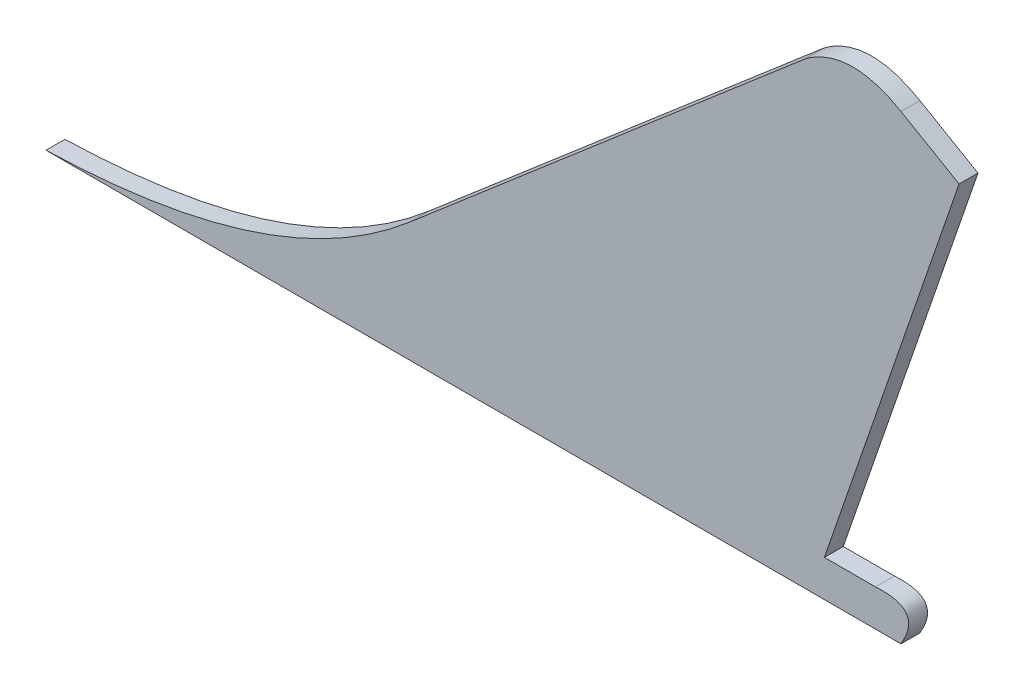
ISO-10303-21;
HEADER;
FILE_DESCRIPTION(('STEP AP214'),'2;1');
FILE_NAME('part.step','',(''),(''),'','','');
FILE_SCHEMA(('AUTOMOTIVE_DESIGN { 1 0 10303 214 1 1 1 1 }'));
ENDSEC;
DATA;
#1=APPLICATION_CONTEXT('core data for automotive mechanical design processes');
#2=APPLICATION_PROTOCOL_DEFINITION('international standard','automotive_design',2000,#1);
#3=PRODUCT_CONTEXT('',#1,'mechanical');
#4=PRODUCT('Part','Part','',(#3));
#5=PRODUCT_RELATED_PRODUCT_CATEGORY('part','',(#4));
#6=PRODUCT_DEFINITION_FORMATION('','',#4);
#7=PRODUCT_DEFINITION_CONTEXT('part definition',#1,'design');
#8=PRODUCT_DEFINITION('design','',#6,#7);
#9=PRODUCT_DEFINITION_SHAPE('','',#8);
#10=(LENGTH_UNIT() NAMED_UNIT(*) SI_UNIT(.MILLI.,.METRE.));
#11=(NAMED_UNIT(*) PLANE_ANGLE_UNIT() SI_UNIT($,.RADIAN.));
#12=(NAMED_UNIT(*) SI_UNIT($,.STERADIAN.) SOLID_ANGLE_UNIT());
#13=UNCERTAINTY_MEASURE_WITH_UNIT(LENGTH_MEASURE(1.E-05),#10,'distance_accuracy_value','');
#14=(GEOMETRIC_REPRESENTATION_CONTEXT(3) GLOBAL_UNCERTAINTY_ASSIGNED_CONTEXT((#13)) GLOBAL_UNIT_ASSIGNED_CONTEXT((#10,
#11,#12)) REPRESENTATION_CONTEXT('',''));
#15=CARTESIAN_POINT('',(0.,0.,0.));
#16=DIRECTION('',(0.,0.,1.));
#17=DIRECTION('',(1.,0.,0.));
#18=AXIS2_PLACEMENT_3D('',#15,#16,#17);
#19=CARTESIAN_POINT('',(11654.9305342296,3598.52963592277,100.));
#20=CARTESIAN_POINT('',(11109.5753336696,3130.94299727136,100.));
#21=CARTESIAN_POINT('',(10415.4410981808,2985.30812270798,100.));
#22=CARTESIAN_POINT('',(9730.00719467646,2965.05728121429,100.));
#23=B_SPLINE_CURVE_WITH_KNOTS('',3,(#19,#20,#21,#22),.UNSPECIFIED.,.F.,.F.,(4,4),(0.,1.),.UNSPECIFIED.);
#24=DIRECTION('',(0.,0.,-1.));
#25=VECTOR('',#24,1.);
#26=SURFACE_OF_LINEAR_EXTRUSION('',#23,#25);
#27=CARTESIAN_POINT('',(11654.9305342296,3598.52963592277,0.));
#28=CARTESIAN_POINT('',(11109.5753336696,3130.94299727136,0.));
#29=CARTESIAN_POINT('',(10415.4410981808,2985.30812270798,0.));
#30=CARTESIAN_POINT('',(9730.00719467646,2965.05728121429,0.));
#31=B_SPLINE_CURVE_WITH_KNOTS('',3,(#27,#28,#29,#30),.UNSPECIFIED.,.F.,.F.,(4,4),(0.,1.),.UNSPECIFIED.);
#32=CARTESIAN_POINT('',(11654.9305342296,3598.52963592277,0.));
#33=VERTEX_POINT('',#32);
#34=CARTESIAN_POINT('',(9730.00719467646,2965.05728121429,0.));
#35=VERTEX_POINT('',#34);
#36=EDGE_CURVE('E193',#33,#35,#31,.T.);
#37=ORIENTED_EDGE('',*,*,#36,.T.);
#38=DIRECTION('',(0.,0.,-1.));
#39=VECTOR('',#38,1.);
#40=CARTESIAN_POINT('',(9730.00719467646,2965.05728121429,100.));
#41=LINE('',#40,#39);
#42=CARTESIAN_POINT('',(9730.00719467646,2965.05728121429,100.));
#43=VERTEX_POINT('',#42);
#44=EDGE_CURVE('E11',#43,#35,#41,.T.);
#45=ORIENTED_EDGE('',*,*,#44,.F.);
#46=CARTESIAN_POINT('',(11654.9305342296,3598.52963592277,100.));
#47=VERTEX_POINT('',#46);
#48=EDGE_CURVE('E210',#47,#43,#23,.T.);
#49=ORIENTED_EDGE('',*,*,#48,.F.);
#50=DIRECTION('',(0.,0.,-1.));
#51=VECTOR('',#50,1.);
#52=CARTESIAN_POINT('',(11654.9305342296,3598.52963592277,100.));
#53=LINE('',#52,#51);
#54=EDGE_CURVE('E127',#47,#33,#53,.T.);
#55=ORIENTED_EDGE('',*,*,#54,.T.);
#56=EDGE_LOOP('',(#37,#45,#49,#55));
#57=FACE_BOUND('',#56,.T.);
#58=ADVANCED_FACE('F34',(#57),#26,.F.);
#59=CARTESIAN_POINT('',(9730.00719467646,2965.05728121429,100.));
#60=DIRECTION('',(0.,1.,0.));
#61=DIRECTION('',(0.,0.,1.));
#62=AXIS2_PLACEMENT_3D('',#59,#60,#61);
#63=PLANE('',#62);
#64=DIRECTION('',(1.,0.,0.));
#65=VECTOR('',#64,1.);
#66=CARTESIAN_POINT('',(9730.00719467646,2965.05728121429,0.));
#67=LINE('',#66,#65);
#68=CARTESIAN_POINT('',(14253.5770426264,2965.05728121429,0.));
#69=VERTEX_POINT('',#68);
#70=EDGE_CURVE('E190',#35,#69,#67,.T.);
#71=ORIENTED_EDGE('',*,*,#70,.T.);
#72=DIRECTION('',(0.,0.,-1.));
#73=VECTOR('',#72,1.);
#74=CARTESIAN_POINT('',(14253.5770426264,2965.05728121429,100.));
#75=LINE('',#74,#73);
#76=CARTESIAN_POINT('',(14253.5770426264,2965.05728121429,100.));
#77=VERTEX_POINT('',#76);
#78=EDGE_CURVE('E43',#77,#69,#75,.T.);
#79=ORIENTED_EDGE('',*,*,#78,.F.);
#80=DIRECTION('',(1.,0.,0.));
#81=VECTOR('',#80,1.);
#82=CARTESIAN_POINT('',(9730.00719467646,2965.05728121429,100.));
#83=LINE('',#82,#81);
#84=EDGE_CURVE('E94',#43,#77,#83,.T.);
#85=ORIENTED_EDGE('',*,*,#84,.F.);
#86=ORIENTED_EDGE('',*,*,#44,.T.);
#87=EDGE_LOOP('',(#71,#79,#85,#86));
#88=FACE_BOUND('',#87,.T.);
#89=ADVANCED_FACE('F156',(#88),#63,.F.);
#90=CARTESIAN_POINT('',(14253.5770426264,2965.05728121429,100.));
#91=CARTESIAN_POINT('',(14378.3959916559,3174.21126567757,100.));
#92=CARTESIAN_POINT('',(14118.8324088577,3158.60324778963,100.));
#93=B_SPLINE_CURVE_WITH_KNOTS('',2,(#90,#91,#92),.UNSPECIFIED.,.F.,.F.,(3,3),(0.,1.),.UNSPECIFIED.);
#94=DIRECTION('',(0.,0.,-1.));
#95=VECTOR('',#94,1.);
#96=SURFACE_OF_LINEAR_EXTRUSION('',#93,#95);
#97=CARTESIAN_POINT('',(14253.5770426264,2965.05728121429,0.));
#98=CARTESIAN_POINT('',(14378.3959916559,3174.21126567757,0.));
#99=CARTESIAN_POINT('',(14118.8324088577,3158.60324778963,0.));
#100=B_SPLINE_CURVE_WITH_KNOTS('',2,(#97,#98,#99),.UNSPECIFIED.,.F.,.F.,(3,3),(0.,1.),.UNSPECIFIED.);
#101=CARTESIAN_POINT('',(14118.8324088577,3158.60324778963,0.));
#102=VERTEX_POINT('',#101);
#103=EDGE_CURVE('E186',#69,#102,#100,.T.);
#104=ORIENTED_EDGE('',*,*,#103,.T.);
#105=DIRECTION('',(0.,0.,-1.));
#106=VECTOR('',#105,1.);
#107=CARTESIAN_POINT('',(14118.8324088577,3158.60324778963,100.));
#108=LINE('',#107,#106);
#109=CARTESIAN_POINT('',(14118.8324088577,3158.60324778963,100.));
#110=VERTEX_POINT('',#109);
#111=EDGE_CURVE('E178',#110,#102,#108,.T.);
#112=ORIENTED_EDGE('',*,*,#111,.F.);
#113=EDGE_CURVE('E158',#77,#110,#93,.T.);
#114=ORIENTED_EDGE('',*,*,#113,.F.);
#115=ORIENTED_EDGE('',*,*,#78,.T.);
#116=EDGE_LOOP('',(#104,#112,#114,#115));
#117=FACE_BOUND('',#116,.T.);
#118=ADVANCED_FACE('F152',(#117),#96,.F.);
#119=CARTESIAN_POINT('',(13848.2454486418,3158.60324778963,100.));
#120=DIRECTION('',(0.,-1.,0.));
#121=DIRECTION('',(0.,0.,-1.));
#122=AXIS2_PLACEMENT_3D('',#119,#120,#121);
#123=PLANE('',#122);
#124=DIRECTION('',(-1.,0.,0.));
#125=VECTOR('',#124,1.);
#126=CARTESIAN_POINT('',(13848.2454486418,3158.60324778963,0.));
#127=LINE('',#126,#125);
#128=CARTESIAN_POINT('',(13848.2454486418,3158.60324778963,0.));
#129=VERTEX_POINT('',#128);
#130=EDGE_CURVE('E176',#102,#129,#127,.T.);
#131=ORIENTED_EDGE('',*,*,#130,.T.);
#132=DIRECTION('',(0.,0.,-1.));
#133=VECTOR('',#132,1.);
#134=CARTESIAN_POINT('',(13848.2454486418,3158.60324778963,100.));
#135=LINE('',#134,#133);
#136=CARTESIAN_POINT('',(13848.2454486418,3158.60324778963,100.));
#137=VERTEX_POINT('',#136);
#138=EDGE_CURVE('E174',#137,#129,#135,.T.);
#139=ORIENTED_EDGE('',*,*,#138,.F.);
#140=DIRECTION('',(-1.,0.,0.));
#141=VECTOR('',#140,1.);
#142=CARTESIAN_POINT('',(13848.2454486418,3158.60324778963,100.));
#143=LINE('',#142,#141);
#144=EDGE_CURVE('E164',#110,#137,#143,.T.);
#145=ORIENTED_EDGE('',*,*,#144,.F.);
#146=ORIENTED_EDGE('',*,*,#111,.T.);
#147=EDGE_LOOP('',(#131,#139,#145,#146));
#148=FACE_BOUND('',#147,.T.);
#149=ADVANCED_FACE('F148',(#148),#123,.F.);
#150=CARTESIAN_POINT('',(14561.0650240472,5225.90232382175,100.));
#151=DIRECTION('',(-0.945378925287942,0.32597344619066,0.));
#152=DIRECTION('',(-0.32597344619066,-0.945378925287942,0.));
#153=AXIS2_PLACEMENT_3D('',#150,#151,#152);
#154=PLANE('',#153);
#155=DIRECTION('',(0.32597344619066,0.945378925287942,0.));
#156=VECTOR('',#155,1.);
#157=CARTESIAN_POINT('',(14561.0650240472,5225.90232382175,0.));
#158=LINE('',#157,#156);
#159=CARTESIAN_POINT('',(14561.0650240472,5225.90232382175,0.));
#160=VERTEX_POINT('',#159);
#161=EDGE_CURVE('E180',#129,#160,#158,.T.);
#162=ORIENTED_EDGE('',*,*,#161,.T.);
#163=DIRECTION('',(0.,0.,-1.));
#164=VECTOR('',#163,1.);
#165=CARTESIAN_POINT('',(14561.0650240472,5225.90232382175,100.));
#166=LINE('',#165,#164);
#167=CARTESIAN_POINT('',(14561.0650240472,5225.90232382175,100.));
#168=VERTEX_POINT('',#167);
#169=EDGE_CURVE('E122',#168,#160,#166,.T.);
#170=ORIENTED_EDGE('',*,*,#169,.F.);
#171=DIRECTION('',(0.32597344619066,0.945378925287942,0.));
#172=VECTOR('',#171,1.);
#173=CARTESIAN_POINT('',(14561.0650240472,5225.90232382175,100.));
#174=LINE('',#173,#172);
#175=EDGE_CURVE('E113',#137,#168,#174,.T.);
#176=ORIENTED_EDGE('',*,*,#175,.F.);
#177=ORIENTED_EDGE('',*,*,#138,.T.);
#178=EDGE_LOOP('',(#162,#170,#176,#177));
#179=FACE_BOUND('',#178,.T.);
#180=ADVANCED_FACE('F145',(#179),#154,.F.);
#181=CARTESIAN_POINT('',(14253.5770426264,5404.48152434595,100.));
#182=DIRECTION('',(-0.502214999034167,-0.864742791091728,0.));
#183=DIRECTION('',(0.864742791091728,-0.502214999034167,0.));
#184=AXIS2_PLACEMENT_3D('',#181,#182,#183);
#185=PLANE('',#184);
#186=DIRECTION('',(-0.864742791091728,0.502214999034167,0.));
#187=VECTOR('',#186,1.);
#188=CARTESIAN_POINT('',(14253.5770426264,5404.48152434595,0.));
#189=LINE('',#188,#187);
#190=CARTESIAN_POINT('',(14253.5770426264,5404.48152434595,0.));
#191=VERTEX_POINT('',#190);
#192=EDGE_CURVE('E121',#160,#191,#189,.T.);
#193=ORIENTED_EDGE('',*,*,#192,.T.);
#194=DIRECTION('',(0.,0.,-1.));
#195=VECTOR('',#194,1.);
#196=CARTESIAN_POINT('',(14253.5770426264,5404.48152434595,100.));
#197=LINE('',#196,#195);
#198=CARTESIAN_POINT('',(14253.5770426264,5404.48152434595,100.));
#199=VERTEX_POINT('',#198);
#200=EDGE_CURVE('E118',#199,#191,#197,.T.);
#201=ORIENTED_EDGE('',*,*,#200,.F.);
#202=DIRECTION('',(-0.864742791091728,0.502214999034167,0.));
#203=VECTOR('',#202,1.);
#204=CARTESIAN_POINT('',(14253.5770426264,5404.48152434595,100.));
#205=LINE('',#204,#203);
#206=EDGE_CURVE('E107',#168,#199,#205,.T.);
#207=ORIENTED_EDGE('',*,*,#206,.F.);
#208=ORIENTED_EDGE('',*,*,#169,.T.);
#209=EDGE_LOOP('',(#193,#201,#207,#208));
#210=FACE_BOUND('',#209,.T.);
#211=ADVANCED_FACE('F119',(#210),#185,.F.);
#212=CARTESIAN_POINT('',(14253.5770426264,5404.48152434595,100.));
#213=CARTESIAN_POINT('',(14071.3196224146,5510.33081393656,100.));
#214=CARTESIAN_POINT('',(13902.8888302037,5506.62629724234,100.));
#215=CARTESIAN_POINT('',(13748.2846659937,5393.3679742633,100.));
#216=B_SPLINE_CURVE_WITH_KNOTS('',3,(#212,#213,#214,#215),.UNSPECIFIED.,.F.,.F.,(4,4),(0.,1.),.UNSPECIFIED.);
#217=DIRECTION('',(0.,0.,-1.));
#218=VECTOR('',#217,1.);
#219=SURFACE_OF_LINEAR_EXTRUSION('',#216,#218);
#220=CARTESIAN_POINT('',(14253.5770426264,5404.48152434595,0.));
#221=CARTESIAN_POINT('',(14071.3196224146,5510.33081393656,0.));
#222=CARTESIAN_POINT('',(13902.8888302037,5506.62629724234,0.));
#223=CARTESIAN_POINT('',(13748.2846659937,5393.3679742633,0.));
#224=B_SPLINE_CURVE_WITH_KNOTS('',3,(#220,#221,#222,#223),.UNSPECIFIED.,.F.,.F.,(4,4),(0.,1.),.UNSPECIFIED.);
#225=CARTESIAN_POINT('',(13748.2846659937,5393.3679742633,0.));
#226=VERTEX_POINT('',#225);
#227=EDGE_CURVE('E80',#191,#226,#224,.T.);
#228=ORIENTED_EDGE('',*,*,#227,.T.);
#229=DIRECTION('',(0.,0.,-1.));
#230=VECTOR('',#229,1.);
#231=CARTESIAN_POINT('',(13748.2846659937,5393.3679742633,100.));
#232=LINE('',#231,#230);
#233=CARTESIAN_POINT('',(13748.2846659937,5393.3679742633,100.));
#234=VERTEX_POINT('',#233);
#235=EDGE_CURVE('E123',#234,#226,#232,.T.);
#236=ORIENTED_EDGE('',*,*,#235,.F.);
#237=EDGE_CURVE('E111',#199,#234,#216,.T.);
#238=ORIENTED_EDGE('',*,*,#237,.F.);
#239=ORIENTED_EDGE('',*,*,#200,.T.);
#240=EDGE_LOOP('',(#228,#236,#238,#239));
#241=FACE_BOUND('',#240,.T.);
#242=ADVANCED_FACE('F125',(#241),#219,.F.);
#243=CARTESIAN_POINT('',(11654.9305342296,3598.52963592277,100.));
#244=DIRECTION('',(0.65090317031905,-0.75916076220298,0.));
#245=DIRECTION('',(0.75916076220298,0.65090317031905,0.));
#246=AXIS2_PLACEMENT_3D('',#243,#244,#245);
#247=PLANE('',#246);
#248=DIRECTION('',(-0.75916076220298,-0.65090317031905,0.));
#249=VECTOR('',#248,1.);
#250=CARTESIAN_POINT('',(11654.9305342296,3598.52963592277,0.));
#251=LINE('',#250,#249);
#252=EDGE_CURVE('E86',#226,#33,#251,.T.);
#253=ORIENTED_EDGE('',*,*,#252,.T.);
#254=ORIENTED_EDGE('',*,*,#54,.F.);
#255=DIRECTION('',(-0.75916076220298,-0.65090317031905,0.));
#256=VECTOR('',#255,1.);
#257=CARTESIAN_POINT('',(11654.9305342296,3598.52963592277,100.));
#258=LINE('',#257,#256);
#259=EDGE_CURVE('E51',#234,#47,#258,.T.);
#260=ORIENTED_EDGE('',*,*,#259,.F.);
#261=ORIENTED_EDGE('',*,*,#235,.T.);
#262=EDGE_LOOP('',(#253,#254,#260,#261));
#263=FACE_BOUND('',#262,.T.);
#264=ADVANCED_FACE('F141',(#263),#247,.F.);
#265=CARTESIAN_POINT('',(10744.9983780571,3114.04253463438,100.));
#266=DIRECTION('',(0.,0.,-1.));
#267=DIRECTION('',(-1.,0.,0.));
#268=AXIS2_PLACEMENT_3D('',#265,#266,#267);
#269=PLANE('',#268);
#270=ORIENTED_EDGE('',*,*,#48,.T.);
#271=ORIENTED_EDGE('',*,*,#84,.T.);
#272=ORIENTED_EDGE('',*,*,#113,.T.);
#273=ORIENTED_EDGE('',*,*,#144,.T.);
#274=ORIENTED_EDGE('',*,*,#175,.T.);
#275=ORIENTED_EDGE('',*,*,#206,.T.);
#276=ORIENTED_EDGE('',*,*,#237,.T.);
#277=ORIENTED_EDGE('',*,*,#259,.T.);
#278=EDGE_LOOP('',(#270,#271,#272,#273,#274,#275,#276,#277));
#279=FACE_BOUND('',#278,.T.);
#280=ADVANCED_FACE('F109',(#279),#269,.F.);
#281=CARTESIAN_POINT('',(10744.9983780571,3114.04253463438,0.));
#282=DIRECTION('',(0.,0.,-1.));
#283=DIRECTION('',(-1.,0.,0.));
#284=AXIS2_PLACEMENT_3D('',#281,#282,#283);
#285=PLANE('',#284);
#286=ORIENTED_EDGE('',*,*,#36,.F.);
#287=ORIENTED_EDGE('',*,*,#252,.F.);
#288=ORIENTED_EDGE('',*,*,#227,.F.);
#289=ORIENTED_EDGE('',*,*,#192,.F.);
#290=ORIENTED_EDGE('',*,*,#161,.F.);
#291=ORIENTED_EDGE('',*,*,#130,.F.);
#292=ORIENTED_EDGE('',*,*,#103,.F.);
#293=ORIENTED_EDGE('',*,*,#70,.F.);
#294=EDGE_LOOP('',(#286,#287,#288,#289,#290,#291,#292,#293));
#295=FACE_BOUND('',#294,.T.);
#296=ADVANCED_FACE('F189',(#295),#285,.T.);
#297=CLOSED_SHELL('',(#58,#89,#118,#149,#180,#211,#242,#264,#280,#296));
#298=MANIFOLD_SOLID_BREP('B2',#297);
#299=ADVANCED_BREP_SHAPE_REPRESENTATION('',(#18,#298),#14);
#300=SHAPE_DEFINITION_REPRESENTATION(#9,#299);
ENDSEC;
END-ISO-10303-21;
